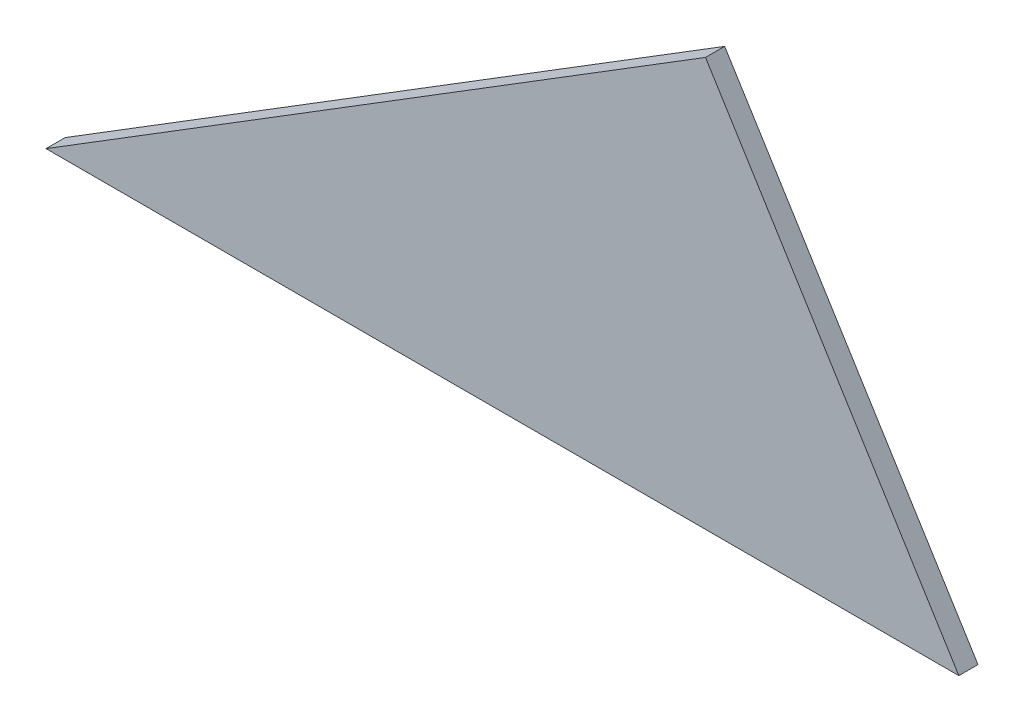
ISO-10303-21;
HEADER;
FILE_DESCRIPTION(('STEP AP214'),'2;1');
FILE_NAME('part.step','',(''),(''),'','','');
FILE_SCHEMA(('AUTOMOTIVE_DESIGN { 1 0 10303 214 1 1 1 1 }'));
ENDSEC;
DATA;
#1=APPLICATION_CONTEXT('core data for automotive mechanical design processes');
#2=APPLICATION_PROTOCOL_DEFINITION('international standard','automotive_design',2000,#1);
#3=PRODUCT_CONTEXT('',#1,'mechanical');
#4=PRODUCT('Part','Part','',(#3));
#5=PRODUCT_RELATED_PRODUCT_CATEGORY('part','',(#4));
#6=PRODUCT_DEFINITION_FORMATION('','',#4);
#7=PRODUCT_DEFINITION_CONTEXT('part definition',#1,'design');
#8=PRODUCT_DEFINITION('design','',#6,#7);
#9=PRODUCT_DEFINITION_SHAPE('','',#8);
#10=(LENGTH_UNIT() NAMED_UNIT(*) SI_UNIT(.MILLI.,.METRE.));
#11=(NAMED_UNIT(*) PLANE_ANGLE_UNIT() SI_UNIT($,.RADIAN.));
#12=(NAMED_UNIT(*) SI_UNIT($,.STERADIAN.) SOLID_ANGLE_UNIT());
#13=UNCERTAINTY_MEASURE_WITH_UNIT(LENGTH_MEASURE(1.E-05),#10,'distance_accuracy_value','');
#14=(GEOMETRIC_REPRESENTATION_CONTEXT(3) GLOBAL_UNCERTAINTY_ASSIGNED_CONTEXT((#13)) GLOBAL_UNIT_ASSIGNED_CONTEXT((#10,
#11,#12)) REPRESENTATION_CONTEXT('',''));
#15=CARTESIAN_POINT('',(0.,0.,0.));
#16=DIRECTION('',(0.,0.,1.));
#17=DIRECTION('',(1.,0.,0.));
#18=AXIS2_PLACEMENT_3D('',#15,#16,#17);
#19=CARTESIAN_POINT('',(95.3029802501387,0.,-2.));
#20=DIRECTION('',(0.,-1.,0.));
#21=DIRECTION('',(0.,0.,-1.));
#22=AXIS2_PLACEMENT_3D('',#19,#20,#21);
#23=PLANE('',#22);
#24=DIRECTION('',(1.,0.,0.));
#25=VECTOR('',#24,1.);
#26=CARTESIAN_POINT('',(95.3029802501387,0.,0.));
#27=LINE('',#26,#25);
#28=CARTESIAN_POINT('',(0.,0.,0.));
#29=VERTEX_POINT('',#28);
#30=CARTESIAN_POINT('',(95.3029802501387,0.,0.));
#31=VERTEX_POINT('',#30);
#32=EDGE_CURVE('E87',#29,#31,#27,.T.);
#33=ORIENTED_EDGE('',*,*,#32,.F.);
#34=DIRECTION('',(0.,0.,1.));
#35=VECTOR('',#34,1.);
#36=CARTESIAN_POINT('',(0.,0.,-2.));
#37=LINE('',#36,#35);
#38=CARTESIAN_POINT('',(0.,0.,-2.));
#39=VERTEX_POINT('',#38);
#40=EDGE_CURVE('E11',#39,#29,#37,.T.);
#41=ORIENTED_EDGE('',*,*,#40,.F.);
#42=DIRECTION('',(1.,0.,0.));
#43=VECTOR('',#42,1.);
#44=CARTESIAN_POINT('',(95.3029802501387,0.,-2.));
#45=LINE('',#44,#43);
#46=CARTESIAN_POINT('',(95.3029802501387,0.,-2.));
#47=VERTEX_POINT('',#46);
#48=EDGE_CURVE('E79',#39,#47,#45,.T.);
#49=ORIENTED_EDGE('',*,*,#48,.T.);
#50=DIRECTION('',(0.,0.,1.));
#51=VECTOR('',#50,1.);
#52=CARTESIAN_POINT('',(95.3029802501387,0.,-2.));
#53=LINE('',#52,#51);
#54=EDGE_CURVE('E38',#47,#31,#53,.T.);
#55=ORIENTED_EDGE('',*,*,#54,.T.);
#56=EDGE_LOOP('',(#33,#41,#49,#55));
#57=FACE_BOUND('',#56,.T.);
#58=ADVANCED_FACE('F35',(#57),#23,.T.);
#59=CARTESIAN_POINT('',(0.,0.,-2.));
#60=DIRECTION('',(-0.526802843008837,0.849987508495158,0.));
#61=DIRECTION('',(-0.849987508495158,-0.526802843008837,0.));
#62=AXIS2_PLACEMENT_3D('',#59,#60,#61);
#63=PLANE('',#62);
#64=DIRECTION('',(-0.849987508495158,-0.526802843008837,0.));
#65=VECTOR('',#64,1.);
#66=CARTESIAN_POINT('',(0.,0.,0.));
#67=LINE('',#66,#65);
#68=CARTESIAN_POINT('',(68.8543794336093,42.674371654535,0.));
#69=VERTEX_POINT('',#68);
#70=EDGE_CURVE('E81',#69,#29,#67,.T.);
#71=ORIENTED_EDGE('',*,*,#70,.F.);
#72=DIRECTION('',(0.,0.,1.));
#73=VECTOR('',#72,1.);
#74=CARTESIAN_POINT('',(68.8543794336093,42.674371654535,-2.));
#75=LINE('',#74,#73);
#76=CARTESIAN_POINT('',(68.8543794336093,42.674371654535,-2.));
#77=VERTEX_POINT('',#76);
#78=EDGE_CURVE('E44',#77,#69,#75,.T.);
#79=ORIENTED_EDGE('',*,*,#78,.F.);
#80=DIRECTION('',(-0.849987508495158,-0.526802843008837,0.));
#81=VECTOR('',#80,1.);
#82=CARTESIAN_POINT('',(0.,0.,-2.));
#83=LINE('',#82,#81);
#84=EDGE_CURVE('E76',#77,#39,#83,.T.);
#85=ORIENTED_EDGE('',*,*,#84,.T.);
#86=ORIENTED_EDGE('',*,*,#40,.T.);
#87=EDGE_LOOP('',(#71,#79,#85,#86));
#88=FACE_BOUND('',#87,.T.);
#89=ADVANCED_FACE('F91',(#88),#63,.T.);
#90=CARTESIAN_POINT('',(68.8543794336093,42.674371654535,-2.));
#91=DIRECTION('',(0.849987508495158,0.526802843008837,0.));
#92=DIRECTION('',(-0.526802843008838,0.849987508495158,0.));
#93=AXIS2_PLACEMENT_3D('',#90,#91,#92);
#94=PLANE('',#93);
#95=DIRECTION('',(-0.526802843008837,0.849987508495158,0.));
#96=VECTOR('',#95,1.);
#97=CARTESIAN_POINT('',(68.8543794336093,42.674371654535,0.));
#98=LINE('',#97,#96);
#99=EDGE_CURVE('E74',#31,#69,#98,.T.);
#100=ORIENTED_EDGE('',*,*,#99,.F.);
#101=ORIENTED_EDGE('',*,*,#54,.F.);
#102=DIRECTION('',(-0.526802843008837,0.849987508495158,0.));
#103=VECTOR('',#102,1.);
#104=CARTESIAN_POINT('',(68.8543794336093,42.674371654535,-2.));
#105=LINE('',#104,#103);
#106=EDGE_CURVE('E72',#47,#77,#105,.T.);
#107=ORIENTED_EDGE('',*,*,#106,.T.);
#108=ORIENTED_EDGE('',*,*,#78,.T.);
#109=EDGE_LOOP('',(#100,#101,#107,#108));
#110=FACE_BOUND('',#109,.T.);
#111=ADVANCED_FACE('F71',(#110),#94,.T.);
#112=CARTESIAN_POINT('',(0.,0.,-2.));
#113=DIRECTION('',(0.,0.,1.));
#114=DIRECTION('',(1.,0.,0.));
#115=AXIS2_PLACEMENT_3D('',#112,#113,#114);
#116=PLANE('',#115);
#117=ORIENTED_EDGE('',*,*,#48,.F.);
#118=ORIENTED_EDGE('',*,*,#84,.F.);
#119=ORIENTED_EDGE('',*,*,#106,.F.);
#120=EDGE_LOOP('',(#117,#118,#119));
#121=FACE_BOUND('',#120,.T.);
#122=ADVANCED_FACE('F78',(#121),#116,.F.);
#123=CARTESIAN_POINT('',(0.,0.,0.));
#124=DIRECTION('',(0.,0.,1.));
#125=DIRECTION('',(1.,0.,0.));
#126=AXIS2_PLACEMENT_3D('',#123,#124,#125);
#127=PLANE('',#126);
#128=ORIENTED_EDGE('',*,*,#32,.T.);
#129=ORIENTED_EDGE('',*,*,#99,.T.);
#130=ORIENTED_EDGE('',*,*,#70,.T.);
#131=EDGE_LOOP('',(#128,#129,#130));
#132=FACE_BOUND('',#131,.T.);
#133=ADVANCED_FACE('F90',(#132),#127,.T.);
#134=CLOSED_SHELL('',(#58,#89,#111,#122,#133));
#135=MANIFOLD_SOLID_BREP('B2',#134);
#136=ADVANCED_BREP_SHAPE_REPRESENTATION('',(#18,#135),#14);
#137=SHAPE_DEFINITION_REPRESENTATION(#9,#136);
ENDSEC;
END-ISO-10303-21;
